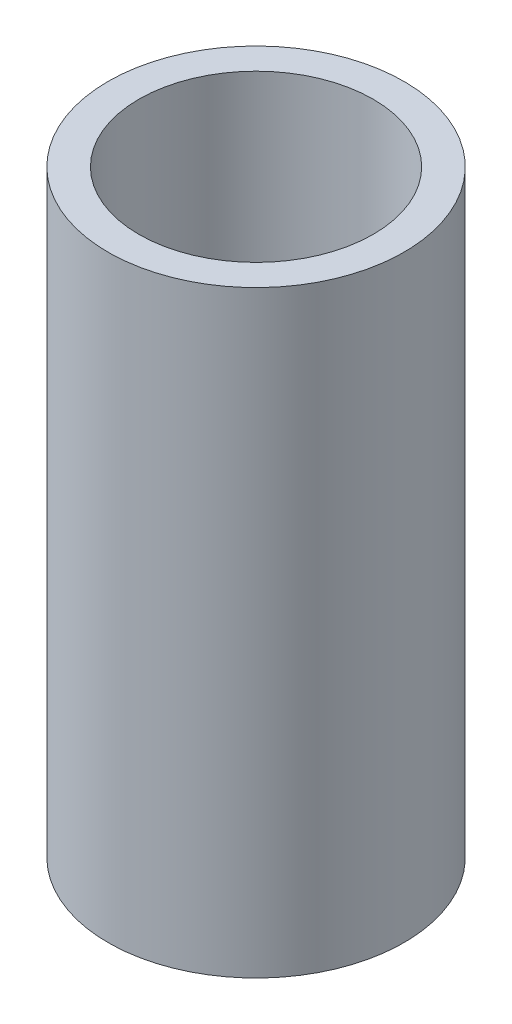
ISO-10303-21;
HEADER;
FILE_DESCRIPTION(('STEP AP214'),'2;1');
FILE_NAME('part.step','',(''),(''),'','','');
FILE_SCHEMA(('AUTOMOTIVE_DESIGN { 1 0 10303 214 1 1 1 1 }'));
ENDSEC;
DATA;
#1=APPLICATION_CONTEXT('core data for automotive mechanical design processes');
#2=APPLICATION_PROTOCOL_DEFINITION('international standard','automotive_design',2000,#1);
#3=PRODUCT_CONTEXT('',#1,'mechanical');
#4=PRODUCT('Part','Part','',(#3));
#5=PRODUCT_RELATED_PRODUCT_CATEGORY('part','',(#4));
#6=PRODUCT_DEFINITION_FORMATION('','',#4);
#7=PRODUCT_DEFINITION_CONTEXT('part definition',#1,'design');
#8=PRODUCT_DEFINITION('design','',#6,#7);
#9=PRODUCT_DEFINITION_SHAPE('','',#8);
#10=(LENGTH_UNIT() NAMED_UNIT(*) SI_UNIT(.MILLI.,.METRE.));
#11=(NAMED_UNIT(*) PLANE_ANGLE_UNIT() SI_UNIT($,.RADIAN.));
#12=(NAMED_UNIT(*) SI_UNIT($,.STERADIAN.) SOLID_ANGLE_UNIT());
#13=UNCERTAINTY_MEASURE_WITH_UNIT(LENGTH_MEASURE(1.E-05),#10,'distance_accuracy_value','');
#14=(GEOMETRIC_REPRESENTATION_CONTEXT(3) GLOBAL_UNCERTAINTY_ASSIGNED_CONTEXT((#13)) GLOBAL_UNIT_ASSIGNED_CONTEXT((#10,
#11,#12)) REPRESENTATION_CONTEXT('',''));
#15=CARTESIAN_POINT('',(0.,0.,0.));
#16=DIRECTION('',(0.,0.,1.));
#17=DIRECTION('',(1.,0.,0.));
#18=AXIS2_PLACEMENT_3D('',#15,#16,#17);
#19=CARTESIAN_POINT('',(-0.239262854092618,-4.56540722323783,1797.));
#20=DIRECTION('',(0.,-1.,0.));
#21=DIRECTION('',(1.,0.,0.));
#22=AXIS2_PLACEMENT_3D('',#19,#20,#21);
#23=PLANE('',#22);
#24=CARTESIAN_POINT('',(878.784034689551,-4.56540722323783,400.));
#25=DIRECTION('',(0.,1.,0.));
#26=DIRECTION('',(-1.,0.,0.));
#27=AXIS2_PLACEMENT_3D('',#24,#25,#26);
#28=CIRCLE('',#27,12.);
#29=CARTESIAN_POINT('',(866.784034689551,-4.56540722323783,400.));
#30=VERTEX_POINT('',#29);
#31=EDGE_CURVE('E21',#30,#30,#28,.F.);
#32=ORIENTED_EDGE('',*,*,#31,.F.);
#33=EDGE_LOOP('',(#32));
#34=FACE_BOUND('',#33,.T.);
#35=CARTESIAN_POINT('',(878.784034689551,-4.56540722323783,400.));
#36=DIRECTION('',(0.,-1.,0.));
#37=DIRECTION('',(1.,0.,0.));
#38=AXIS2_PLACEMENT_3D('',#35,#36,#37);
#39=CIRCLE('',#38,9.49999999999995);
#40=CARTESIAN_POINT('',(888.284034689551,-4.56540722323783,400.));
#41=VERTEX_POINT('',#40);
#42=EDGE_CURVE('E27',#41,#41,#39,.F.);
#43=ORIENTED_EDGE('',*,*,#42,.F.);
#44=EDGE_LOOP('',(#43));
#45=FACE_BOUND('',#44,.T.);
#46=ADVANCED_FACE('F14',(#34,#45),#23,.F.);
#47=CARTESIAN_POINT('',(878.784034689551,-53.0654072232378,400.));
#48=DIRECTION('',(0.,-1.,0.));
#49=DIRECTION('',(1.,0.,0.));
#50=AXIS2_PLACEMENT_3D('',#47,#48,#49);
#51=PLANE('',#50);
#52=CARTESIAN_POINT('',(878.784034689551,-53.0654072232378,400.));
#53=DIRECTION('',(0.,1.,0.));
#54=DIRECTION('',(-1.,0.,0.));
#55=AXIS2_PLACEMENT_3D('',#52,#53,#54);
#56=CIRCLE('',#55,12.);
#57=CARTESIAN_POINT('',(866.784034689551,-53.0654072232378,400.));
#58=VERTEX_POINT('',#57);
#59=EDGE_CURVE('E17',#58,#58,#56,.F.);
#60=ORIENTED_EDGE('',*,*,#59,.T.);
#61=EDGE_LOOP('',(#60));
#62=FACE_BOUND('',#61,.T.);
#63=CARTESIAN_POINT('',(878.784034689551,-53.0654072232378,400.));
#64=DIRECTION('',(0.,-1.,0.));
#65=DIRECTION('',(0.,0.,-1.));
#66=AXIS2_PLACEMENT_3D('',#63,#64,#65);
#67=CIRCLE('',#66,9.49999999999995);
#68=CARTESIAN_POINT('',(878.784034689551,-53.0654072232378,390.5));
#69=VERTEX_POINT('',#68);
#70=EDGE_CURVE('E10',#69,#69,#67,.F.);
#71=ORIENTED_EDGE('',*,*,#70,.T.);
#72=EDGE_LOOP('',(#71));
#73=FACE_BOUND('',#72,.T.);
#74=ADVANCED_FACE('F34',(#62,#73),#51,.T.);
#75=CARTESIAN_POINT('',(878.784034689551,-53.0654072232378,400.));
#76=DIRECTION('',(0.,1.,0.));
#77=DIRECTION('',(-1.,0.,0.));
#78=AXIS2_PLACEMENT_3D('',#75,#76,#77);
#79=CYLINDRICAL_SURFACE('',#78,12.);
#80=ORIENTED_EDGE('',*,*,#59,.F.);
#81=EDGE_LOOP('',(#80));
#82=FACE_BOUND('',#81,.T.);
#83=ORIENTED_EDGE('',*,*,#31,.T.);
#84=EDGE_LOOP('',(#83));
#85=FACE_BOUND('',#84,.T.);
#86=ADVANCED_FACE('F36',(#82,#85),#79,.T.);
#87=CARTESIAN_POINT('',(878.784034689551,-53.0654072232378,400.));
#88=DIRECTION('',(0.,-1.,0.));
#89=DIRECTION('',(0.,0.,-1.));
#90=AXIS2_PLACEMENT_3D('',#87,#88,#89);
#91=CYLINDRICAL_SURFACE('',#90,9.49999999999995);
#92=ORIENTED_EDGE('',*,*,#42,.T.);
#93=EDGE_LOOP('',(#92));
#94=FACE_BOUND('',#93,.T.);
#95=ORIENTED_EDGE('',*,*,#70,.F.);
#96=EDGE_LOOP('',(#95));
#97=FACE_BOUND('',#96,.T.);
#98=ADVANCED_FACE('F39',(#94,#97),#91,.F.);
#99=CLOSED_SHELL('',(#46,#74,#86,#98));
#100=MANIFOLD_SOLID_BREP('B1',#99);
#101=ADVANCED_BREP_SHAPE_REPRESENTATION('',(#18,#100),#14);
#102=SHAPE_DEFINITION_REPRESENTATION(#9,#101);
ENDSEC;
END-ISO-10303-21;
